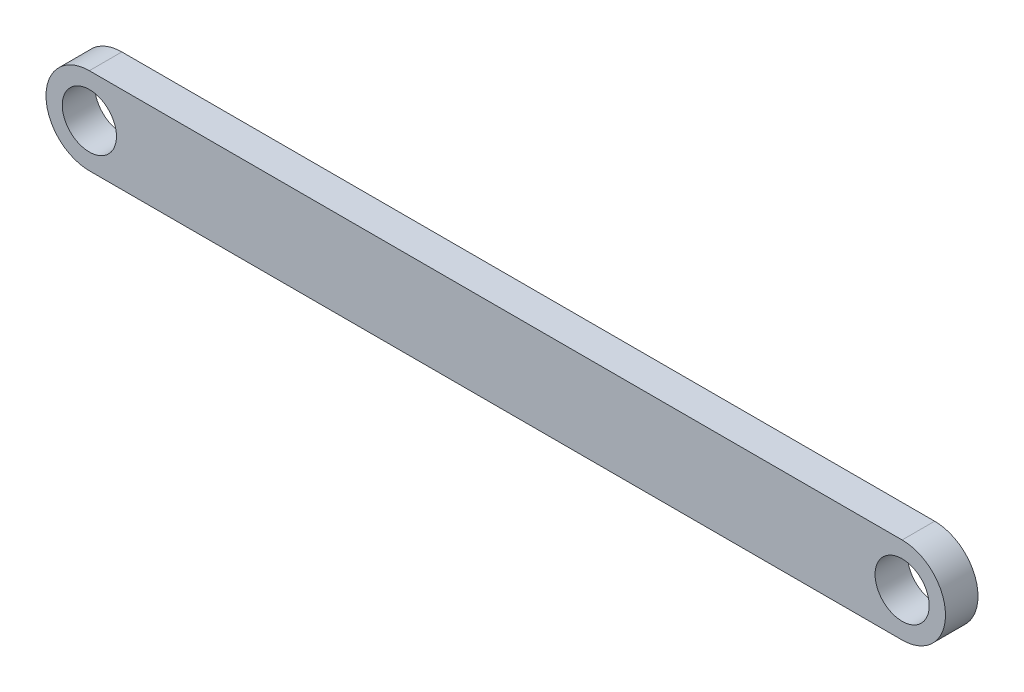
ISO-10303-21;
HEADER;
FILE_DESCRIPTION(('STEP AP214'),'2;1');
FILE_NAME('part.step','',(''),(''),'','','');
FILE_SCHEMA(('AUTOMOTIVE_DESIGN { 1 0 10303 214 1 1 1 1 }'));
ENDSEC;
DATA;
#1=APPLICATION_CONTEXT('core data for automotive mechanical design processes');
#2=APPLICATION_PROTOCOL_DEFINITION('international standard','automotive_design',2000,#1);
#3=PRODUCT_CONTEXT('',#1,'mechanical');
#4=PRODUCT('Part','Part','',(#3));
#5=PRODUCT_RELATED_PRODUCT_CATEGORY('part','',(#4));
#6=PRODUCT_DEFINITION_FORMATION('','',#4);
#7=PRODUCT_DEFINITION_CONTEXT('part definition',#1,'design');
#8=PRODUCT_DEFINITION('design','',#6,#7);
#9=PRODUCT_DEFINITION_SHAPE('','',#8);
#10=(LENGTH_UNIT() NAMED_UNIT(*) SI_UNIT(.MILLI.,.METRE.));
#11=(NAMED_UNIT(*) PLANE_ANGLE_UNIT() SI_UNIT($,.RADIAN.));
#12=(NAMED_UNIT(*) SI_UNIT($,.STERADIAN.) SOLID_ANGLE_UNIT());
#13=UNCERTAINTY_MEASURE_WITH_UNIT(LENGTH_MEASURE(1.E-05),#10,'distance_accuracy_value','');
#14=(GEOMETRIC_REPRESENTATION_CONTEXT(3) GLOBAL_UNCERTAINTY_ASSIGNED_CONTEXT((#13)) GLOBAL_UNIT_ASSIGNED_CONTEXT((#10,
#11,#12)) REPRESENTATION_CONTEXT('',''));
#15=CARTESIAN_POINT('',(0.,0.,0.));
#16=DIRECTION('',(0.,0.,1.));
#17=DIRECTION('',(1.,0.,0.));
#18=AXIS2_PLACEMENT_3D('',#15,#16,#17);
#19=CARTESIAN_POINT('',(-30.372366657307,48.1357164631871,3.));
#20=DIRECTION('',(0.,0.,1.));
#21=DIRECTION('',(1.,0.,0.));
#22=AXIS2_PLACEMENT_3D('',#19,#20,#21);
#23=PLANE('',#22);
#24=CARTESIAN_POINT('',(-30.372366657307,48.1357164631871,3.));
#25=DIRECTION('',(0.,0.,1.));
#26=DIRECTION('',(1.,0.,0.));
#27=AXIS2_PLACEMENT_3D('',#24,#25,#26);
#28=CIRCLE('',#27,2.5);
#29=CARTESIAN_POINT('',(-27.872366657307,48.1357164631871,3.));
#30=VERTEX_POINT('',#29);
#31=EDGE_CURVE('E106',#30,#30,#28,.T.);
#32=ORIENTED_EDGE('',*,*,#31,.F.);
#33=EDGE_LOOP('',(#32));
#34=FACE_BOUND('',#33,.T.);
#35=CARTESIAN_POINT('',(-30.372366657307,48.1357164631871,3.));
#36=DIRECTION('',(0.,0.,1.));
#37=DIRECTION('',(1.,0.,0.));
#38=AXIS2_PLACEMENT_3D('',#35,#36,#37);
#39=CIRCLE('',#38,4.);
#40=CARTESIAN_POINT('',(-30.372366657307,52.1357164631871,3.));
#41=VERTEX_POINT('',#40);
#42=CARTESIAN_POINT('',(-30.372366657307,44.1357164631871,3.));
#43=VERTEX_POINT('',#42);
#44=EDGE_CURVE('E91',#41,#43,#39,.T.);
#45=ORIENTED_EDGE('',*,*,#44,.T.);
#46=DIRECTION('',(1.,0.,0.));
#47=VECTOR('',#46,1.);
#48=CARTESIAN_POINT('',(-30.372366657307,44.1357164631871,3.));
#49=LINE('',#48,#47);
#50=CARTESIAN_POINT('',(44.627633342693,44.1357164631871,3.));
#51=VERTEX_POINT('',#50);
#52=EDGE_CURVE('E86',#43,#51,#49,.T.);
#53=ORIENTED_EDGE('',*,*,#52,.T.);
#54=CARTESIAN_POINT('',(44.627633342693,48.1357164631871,3.));
#55=DIRECTION('',(0.,0.,1.));
#56=DIRECTION('',(-1.,0.,0.));
#57=AXIS2_PLACEMENT_3D('',#54,#55,#56);
#58=CIRCLE('',#57,4.);
#59=CARTESIAN_POINT('',(44.627633342693,52.1357164631871,3.));
#60=VERTEX_POINT('',#59);
#61=EDGE_CURVE('E89',#51,#60,#58,.T.);
#62=ORIENTED_EDGE('',*,*,#61,.T.);
#63=DIRECTION('',(-1.,0.,0.));
#64=VECTOR('',#63,1.);
#65=CARTESIAN_POINT('',(-30.372366657307,52.1357164631871,3.));
#66=LINE('',#65,#64);
#67=EDGE_CURVE('E56',#60,#41,#66,.T.);
#68=ORIENTED_EDGE('',*,*,#67,.T.);
#69=EDGE_LOOP('',(#45,#53,#62,#68));
#70=FACE_BOUND('',#69,.T.);
#71=CARTESIAN_POINT('',(44.627633342693,48.1357164631871,3.));
#72=DIRECTION('',(0.,0.,1.));
#73=DIRECTION('',(1.,0.,0.));
#74=AXIS2_PLACEMENT_3D('',#71,#72,#73);
#75=CIRCLE('',#74,2.5);
#76=CARTESIAN_POINT('',(47.127633342693,48.1357164631871,3.));
#77=VERTEX_POINT('',#76);
#78=EDGE_CURVE('E121',#77,#77,#75,.T.);
#79=ORIENTED_EDGE('',*,*,#78,.F.);
#80=EDGE_LOOP('',(#79));
#81=FACE_BOUND('',#80,.T.);
#82=ADVANCED_FACE('F39',(#34,#70,#81),#23,.T.);
#83=CARTESIAN_POINT('',(-30.372366657307,48.1357164631871,0.));
#84=DIRECTION('',(0.,0.,1.));
#85=DIRECTION('',(1.,0.,0.));
#86=AXIS2_PLACEMENT_3D('',#83,#84,#85);
#87=PLANE('',#86);
#88=CARTESIAN_POINT('',(-30.372366657307,48.1357164631871,0.));
#89=DIRECTION('',(0.,0.,1.));
#90=DIRECTION('',(1.,0.,0.));
#91=AXIS2_PLACEMENT_3D('',#88,#89,#90);
#92=CIRCLE('',#91,4.);
#93=CARTESIAN_POINT('',(-30.372366657307,52.1357164631871,0.));
#94=VERTEX_POINT('',#93);
#95=CARTESIAN_POINT('',(-30.372366657307,44.1357164631871,0.));
#96=VERTEX_POINT('',#95);
#97=EDGE_CURVE('E103',#94,#96,#92,.T.);
#98=ORIENTED_EDGE('',*,*,#97,.F.);
#99=DIRECTION('',(-1.,0.,0.));
#100=VECTOR('',#99,1.);
#101=CARTESIAN_POINT('',(-30.372366657307,52.1357164631871,0.));
#102=LINE('',#101,#100);
#103=CARTESIAN_POINT('',(44.627633342693,52.1357164631871,0.));
#104=VERTEX_POINT('',#103);
#105=EDGE_CURVE('E79',#104,#94,#102,.T.);
#106=ORIENTED_EDGE('',*,*,#105,.F.);
#107=CARTESIAN_POINT('',(44.627633342693,48.1357164631871,0.));
#108=DIRECTION('',(0.,0.,1.));
#109=DIRECTION('',(-1.,0.,0.));
#110=AXIS2_PLACEMENT_3D('',#107,#108,#109);
#111=CIRCLE('',#110,4.);
#112=CARTESIAN_POINT('',(44.627633342693,44.1357164631871,0.));
#113=VERTEX_POINT('',#112);
#114=EDGE_CURVE('E73',#113,#104,#111,.T.);
#115=ORIENTED_EDGE('',*,*,#114,.F.);
#116=DIRECTION('',(1.,0.,0.));
#117=VECTOR('',#116,1.);
#118=CARTESIAN_POINT('',(-30.372366657307,44.1357164631871,0.));
#119=LINE('',#118,#117);
#120=EDGE_CURVE('E95',#96,#113,#119,.T.);
#121=ORIENTED_EDGE('',*,*,#120,.F.);
#122=EDGE_LOOP('',(#98,#106,#115,#121));
#123=FACE_BOUND('',#122,.T.);
#124=CARTESIAN_POINT('',(-30.372366657307,48.1357164631871,0.));
#125=DIRECTION('',(0.,0.,1.));
#126=DIRECTION('',(1.,0.,0.));
#127=AXIS2_PLACEMENT_3D('',#124,#125,#126);
#128=CIRCLE('',#127,2.5);
#129=CARTESIAN_POINT('',(-27.872366657307,48.1357164631871,0.));
#130=VERTEX_POINT('',#129);
#131=EDGE_CURVE('E118',#130,#130,#128,.T.);
#132=ORIENTED_EDGE('',*,*,#131,.T.);
#133=EDGE_LOOP('',(#132));
#134=FACE_BOUND('',#133,.T.);
#135=CARTESIAN_POINT('',(44.627633342693,48.1357164631871,0.));
#136=DIRECTION('',(0.,0.,1.));
#137=DIRECTION('',(1.,0.,0.));
#138=AXIS2_PLACEMENT_3D('',#135,#136,#137);
#139=CIRCLE('',#138,2.5);
#140=CARTESIAN_POINT('',(47.127633342693,48.1357164631871,0.));
#141=VERTEX_POINT('',#140);
#142=EDGE_CURVE('E124',#141,#141,#139,.T.);
#143=ORIENTED_EDGE('',*,*,#142,.T.);
#144=EDGE_LOOP('',(#143));
#145=FACE_BOUND('',#144,.T.);
#146=ADVANCED_FACE('F114',(#123,#134,#145),#87,.F.);
#147=CARTESIAN_POINT('',(-30.372366657307,48.1357164631871,3.));
#148=DIRECTION('',(0.,0.,-1.));
#149=DIRECTION('',(-1.,0.,0.));
#150=AXIS2_PLACEMENT_3D('',#147,#148,#149);
#151=CYLINDRICAL_SURFACE('',#150,4.);
#152=ORIENTED_EDGE('',*,*,#97,.T.);
#153=DIRECTION('',(0.,0.,-1.));
#154=VECTOR('',#153,1.);
#155=CARTESIAN_POINT('',(-30.372366657307,44.1357164631871,3.));
#156=LINE('',#155,#154);
#157=EDGE_CURVE('E11',#43,#96,#156,.T.);
#158=ORIENTED_EDGE('',*,*,#157,.F.);
#159=ORIENTED_EDGE('',*,*,#44,.F.);
#160=DIRECTION('',(0.,0.,-1.));
#161=VECTOR('',#160,1.);
#162=CARTESIAN_POINT('',(-30.372366657307,52.1357164631871,3.));
#163=LINE('',#162,#161);
#164=EDGE_CURVE('E99',#41,#94,#163,.T.);
#165=ORIENTED_EDGE('',*,*,#164,.T.);
#166=EDGE_LOOP('',(#152,#158,#159,#165));
#167=FACE_BOUND('',#166,.T.);
#168=ADVANCED_FACE('F41',(#167),#151,.T.);
#169=CARTESIAN_POINT('',(-30.372366657307,44.1357164631871,3.));
#170=DIRECTION('',(0.,1.,0.));
#171=DIRECTION('',(0.,0.,1.));
#172=AXIS2_PLACEMENT_3D('',#169,#170,#171);
#173=PLANE('',#172);
#174=ORIENTED_EDGE('',*,*,#120,.T.);
#175=DIRECTION('',(0.,0.,-1.));
#176=VECTOR('',#175,1.);
#177=CARTESIAN_POINT('',(44.627633342693,44.1357164631871,3.));
#178=LINE('',#177,#176);
#179=EDGE_CURVE('E48',#51,#113,#178,.T.);
#180=ORIENTED_EDGE('',*,*,#179,.F.);
#181=ORIENTED_EDGE('',*,*,#52,.F.);
#182=ORIENTED_EDGE('',*,*,#157,.T.);
#183=EDGE_LOOP('',(#174,#180,#181,#182));
#184=FACE_BOUND('',#183,.T.);
#185=ADVANCED_FACE('F94',(#184),#173,.F.);
#186=CARTESIAN_POINT('',(44.627633342693,48.1357164631871,3.));
#187=DIRECTION('',(0.,0.,-1.));
#188=DIRECTION('',(-1.,0.,0.));
#189=AXIS2_PLACEMENT_3D('',#186,#187,#188);
#190=CYLINDRICAL_SURFACE('',#189,4.);
#191=ORIENTED_EDGE('',*,*,#114,.T.);
#192=DIRECTION('',(0.,0.,-1.));
#193=VECTOR('',#192,1.);
#194=CARTESIAN_POINT('',(44.627633342693,52.1357164631871,3.));
#195=LINE('',#194,#193);
#196=EDGE_CURVE('E96',#60,#104,#195,.T.);
#197=ORIENTED_EDGE('',*,*,#196,.F.);
#198=ORIENTED_EDGE('',*,*,#61,.F.);
#199=ORIENTED_EDGE('',*,*,#179,.T.);
#200=EDGE_LOOP('',(#191,#197,#198,#199));
#201=FACE_BOUND('',#200,.T.);
#202=ADVANCED_FACE('F97',(#201),#190,.T.);
#203=CARTESIAN_POINT('',(-30.372366657307,52.1357164631871,3.));
#204=DIRECTION('',(0.,-1.,0.));
#205=DIRECTION('',(0.,0.,-1.));
#206=AXIS2_PLACEMENT_3D('',#203,#204,#205);
#207=PLANE('',#206);
#208=ORIENTED_EDGE('',*,*,#105,.T.);
#209=ORIENTED_EDGE('',*,*,#164,.F.);
#210=ORIENTED_EDGE('',*,*,#67,.F.);
#211=ORIENTED_EDGE('',*,*,#196,.T.);
#212=EDGE_LOOP('',(#208,#209,#210,#211));
#213=FACE_BOUND('',#212,.T.);
#214=ADVANCED_FACE('F111',(#213),#207,.F.);
#215=CARTESIAN_POINT('',(-30.372366657307,48.1357164631871,3.));
#216=DIRECTION('',(0.,0.,-1.));
#217=DIRECTION('',(-1.,0.,0.));
#218=AXIS2_PLACEMENT_3D('',#215,#216,#217);
#219=CYLINDRICAL_SURFACE('',#218,2.5);
#220=ORIENTED_EDGE('',*,*,#31,.T.);
#221=EDGE_LOOP('',(#220));
#222=FACE_BOUND('',#221,.T.);
#223=ORIENTED_EDGE('',*,*,#131,.F.);
#224=EDGE_LOOP('',(#223));
#225=FACE_BOUND('',#224,.T.);
#226=ADVANCED_FACE('F141',(#222,#225),#219,.F.);
#227=CARTESIAN_POINT('',(44.627633342693,48.1357164631871,3.));
#228=DIRECTION('',(0.,0.,-1.));
#229=DIRECTION('',(-1.,0.,0.));
#230=AXIS2_PLACEMENT_3D('',#227,#228,#229);
#231=CYLINDRICAL_SURFACE('',#230,2.5);
#232=ORIENTED_EDGE('',*,*,#78,.T.);
#233=EDGE_LOOP('',(#232));
#234=FACE_BOUND('',#233,.T.);
#235=ORIENTED_EDGE('',*,*,#142,.F.);
#236=EDGE_LOOP('',(#235));
#237=FACE_BOUND('',#236,.T.);
#238=ADVANCED_FACE('F130',(#234,#237),#231,.F.);
#239=CLOSED_SHELL('',(#82,#146,#168,#185,#202,#214,#226,#238));
#240=MANIFOLD_SOLID_BREP('B2',#239);
#241=ADVANCED_BREP_SHAPE_REPRESENTATION('',(#18,#240),#14);
#242=SHAPE_DEFINITION_REPRESENTATION(#9,#241);
ENDSEC;
END-ISO-10303-21;
